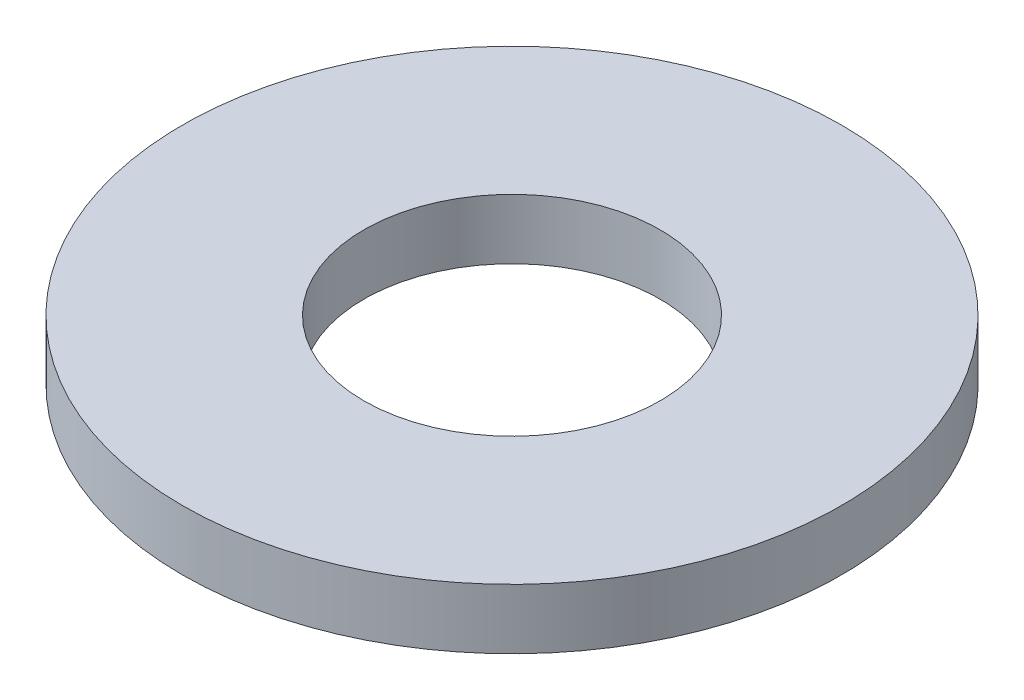
ISO-10303-21;
HEADER;
FILE_DESCRIPTION(('STEP AP214'),'2;1');
FILE_NAME('part.step','',(''),(''),'','','');
FILE_SCHEMA(('AUTOMOTIVE_DESIGN { 1 0 10303 214 1 1 1 1 }'));
ENDSEC;
DATA;
#1=APPLICATION_CONTEXT('core data for automotive mechanical design processes');
#2=APPLICATION_PROTOCOL_DEFINITION('international standard','automotive_design',2000,#1);
#3=PRODUCT_CONTEXT('',#1,'mechanical');
#4=PRODUCT('Part','Part','',(#3));
#5=PRODUCT_RELATED_PRODUCT_CATEGORY('part','',(#4));
#6=PRODUCT_DEFINITION_FORMATION('','',#4);
#7=PRODUCT_DEFINITION_CONTEXT('part definition',#1,'design');
#8=PRODUCT_DEFINITION('design','',#6,#7);
#9=PRODUCT_DEFINITION_SHAPE('','',#8);
#10=(LENGTH_UNIT() NAMED_UNIT(*) SI_UNIT(.MILLI.,.METRE.));
#11=(NAMED_UNIT(*) PLANE_ANGLE_UNIT() SI_UNIT($,.RADIAN.));
#12=(NAMED_UNIT(*) SI_UNIT($,.STERADIAN.) SOLID_ANGLE_UNIT());
#13=UNCERTAINTY_MEASURE_WITH_UNIT(LENGTH_MEASURE(1.E-05),#10,'distance_accuracy_value','');
#14=(GEOMETRIC_REPRESENTATION_CONTEXT(3) GLOBAL_UNCERTAINTY_ASSIGNED_CONTEXT((#13)) GLOBAL_UNIT_ASSIGNED_CONTEXT((#10,
#11,#12)) REPRESENTATION_CONTEXT('',''));
#15=CARTESIAN_POINT('',(0.,0.,0.));
#16=DIRECTION('',(0.,0.,1.));
#17=DIRECTION('',(1.,0.,0.));
#18=AXIS2_PLACEMENT_3D('',#15,#16,#17);
#19=CARTESIAN_POINT('',(0.,1.4478,0.));
#20=DIRECTION('',(0.,-1.,0.));
#21=DIRECTION('',(0.,0.,-0.999999999999999));
#22=AXIS2_PLACEMENT_3D('',#19,#20,#21);
#23=CYLINDRICAL_SURFACE('',#22,7.9375);
#24=CARTESIAN_POINT('',(0.,1.4478,0.));
#25=DIRECTION('',(0.,1.,0.));
#26=DIRECTION('',(0.,0.,0.999999999999999));
#27=AXIS2_PLACEMENT_3D('',#24,#25,#26);
#28=CIRCLE('',#27,7.9375);
#29=CARTESIAN_POINT('',(0.,1.44780000000004,-7.93750000000006));
#30=VERTEX_POINT('',#29);
#31=EDGE_CURVE('E12',#30,#30,#28,.T.);
#32=CARTESIAN_POINT('',(0.,0.,0.));
#33=DIRECTION('',(0.,1.,0.));
#34=DIRECTION('',(0.,0.,0.999999999999999));
#35=AXIS2_PLACEMENT_3D('',#32,#33,#34);
#36=CIRCLE('',#35,7.9375);
#37=CARTESIAN_POINT('',(0.,0.,-7.93750000000007));
#38=VERTEX_POINT('',#37);
#39=EDGE_CURVE('E45',#38,#38,#36,.T.);
#40=CARTESIAN_POINT('',(0.,1.44780000000004,-7.93750000000006));
#41=CARTESIAN_POINT('',(0.,1.43271875000004,-7.93750000000006));
#42=CARTESIAN_POINT('',(0.,1.41763750000004,-7.93750000000006));
#43=CARTESIAN_POINT('',(0.,1.38747500000004,-7.93750000000006));
#44=CARTESIAN_POINT('',(0.,1.37239375000004,-7.93750000000006));
#45=CARTESIAN_POINT('',(0.,1.34223125000004,-7.93750000000006));
#46=CARTESIAN_POINT('',(0.,1.32715000000004,-7.93750000000006));
#47=CARTESIAN_POINT('',(0.,1.29698750000004,-7.93750000000006));
#48=CARTESIAN_POINT('',(0.,1.28190625000004,-7.93750000000007));
#49=CARTESIAN_POINT('',(0.,1.25174375000004,-7.93750000000007));
#50=CARTESIAN_POINT('',(0.,1.23666250000004,-7.93750000000007));
#51=CARTESIAN_POINT('',(0.,1.20650000000004,-7.93750000000007));
#52=CARTESIAN_POINT('',(0.,1.19141875000004,-7.93750000000007));
#53=CARTESIAN_POINT('',(0.,1.16125625000004,-7.93750000000007));
#54=CARTESIAN_POINT('',(0.,1.14617500000004,-7.93750000000007));
#55=CARTESIAN_POINT('',(0.,1.11601250000004,-7.93750000000007));
#56=CARTESIAN_POINT('',(0.,1.10093125000004,-7.93750000000007));
#57=CARTESIAN_POINT('',(0.,1.07076875000004,-7.93750000000007));
#58=CARTESIAN_POINT('',(0.,1.05568750000004,-7.93750000000007));
#59=CARTESIAN_POINT('',(0.,1.02552500000004,-7.93750000000007));
#60=CARTESIAN_POINT('',(0.,1.01044375000004,-7.93750000000007));
#61=CARTESIAN_POINT('',(0.,0.980281250000042,-7.93750000000007));
#62=CARTESIAN_POINT('',(0.,0.965200000000042,-7.93750000000007));
#63=CARTESIAN_POINT('',(0.,0.935037500000042,-7.93750000000007));
#64=CARTESIAN_POINT('',(0.,0.919956250000042,-7.93750000000007));
#65=CARTESIAN_POINT('',(0.,0.889793750000042,-7.93750000000007));
#66=CARTESIAN_POINT('',(0.,0.874712500000042,-7.93750000000007));
#67=CARTESIAN_POINT('',(0.,0.844550000000042,-7.93750000000007));
#68=CARTESIAN_POINT('',(0.,0.829468750000042,-7.93750000000007));
#69=CARTESIAN_POINT('',(0.,0.799306250000042,-7.93750000000007));
#70=CARTESIAN_POINT('',(0.,0.784225000000042,-7.93750000000007));
#71=CARTESIAN_POINT('',(0.,0.754062500000042,-7.93750000000007));
#72=CARTESIAN_POINT('',(0.,0.738981250000042,-7.93750000000007));
#73=CARTESIAN_POINT('',(0.,0.708818750000042,-7.93750000000007));
#74=CARTESIAN_POINT('',(0.,0.693737500000042,-7.93750000000007));
#75=CARTESIAN_POINT('',(0.,0.663575000000042,-7.93750000000007));
#76=CARTESIAN_POINT('',(0.,0.648493750000042,-7.93750000000007));
#77=CARTESIAN_POINT('',(0.,0.618331250000042,-7.93750000000007));
#78=CARTESIAN_POINT('',(0.,0.603250000000042,-7.93750000000007));
#79=CARTESIAN_POINT('',(0.,0.573087500000042,-7.93750000000007));
#80=CARTESIAN_POINT('',(0.,0.558006250000042,-7.93750000000007));
#81=CARTESIAN_POINT('',(0.,0.527843750000042,-7.93750000000007));
#82=CARTESIAN_POINT('',(0.,0.512762500000042,-7.93750000000007));
#83=CARTESIAN_POINT('',(0.,0.482600000000042,-7.93750000000007));
#84=CARTESIAN_POINT('',(0.,0.467518750000042,-7.93750000000007));
#85=CARTESIAN_POINT('',(0.,0.437356250000042,-7.93750000000007));
#86=CARTESIAN_POINT('',(0.,0.422275000000042,-7.93750000000007));
#87=CARTESIAN_POINT('',(0.,0.392112500000042,-7.93750000000007));
#88=CARTESIAN_POINT('',(0.,0.377031250000042,-7.93750000000007));
#89=CARTESIAN_POINT('',(0.,0.346868750000042,-7.93750000000007));
#90=CARTESIAN_POINT('',(0.,0.331787500000042,-7.93750000000007));
#91=CARTESIAN_POINT('',(0.,0.301625000000042,-7.93750000000007));
#92=CARTESIAN_POINT('',(0.,0.286543750000042,-7.93750000000007));
#93=CARTESIAN_POINT('',(0.,0.256381250000042,-7.93750000000007));
#94=CARTESIAN_POINT('',(0.,0.241300000000042,-7.93750000000007));
#95=CARTESIAN_POINT('',(0.,0.211137500000042,-7.93750000000007));
#96=CARTESIAN_POINT('',(0.,0.196056250000042,-7.93750000000007));
#97=CARTESIAN_POINT('',(0.,0.165893750000042,-7.93750000000007));
#98=CARTESIAN_POINT('',(0.,0.150812500000042,-7.93750000000007));
#99=CARTESIAN_POINT('',(0.,0.120650000000042,-7.93750000000007));
#100=CARTESIAN_POINT('',(0.,0.105568750000042,-7.93750000000007));
#101=CARTESIAN_POINT('',(0.,0.0754062500000424,-7.93750000000007));
#102=CARTESIAN_POINT('',(0.,0.0603250000000425,-7.93750000000007));
#103=CARTESIAN_POINT('',(0.,0.0301625000000425,-7.93750000000007));
#104=CARTESIAN_POINT('',(0.,0.0150812500000425,-7.93750000000007));
#105=CARTESIAN_POINT('',(0.,0.,-7.93750000000007));
#106=B_SPLINE_CURVE_WITH_KNOTS('',3,(#40,#41,#42,#43,#44,#45,#46,#47,#48,#49,#50,#51,#52,#53,
#54,#55,#56,#57,#58,#59,#60,#61,#62,#63,#64,#65,#66,#67,#68,#69,#70,#71,#72,#73,#74,#75,#76,#77,
#78,#79,#80,#81,#82,#83,#84,#85,#86,#87,#88,#89,#90,#91,#92,#93,#94,#95,#96,#97,#98,#99,#100,
#101,#102,#103,#104,#105),.UNSPECIFIED.,.F.,.F.,(4,2,2,2,2,2,2,2,2,2,2,2,2,2,2,2,2,2,2,2,2,2,2,
2,2,2,2,2,2,2,2,2,4),(0.,0.04524375,0.0904874999999999,0.13573125,0.180975,0.22621875,0.2714625,
0.31670625,0.36195,0.40719375,0.4524375,0.49768125,0.542925,0.58816875,0.6334125,0.67865625,
0.7239,0.76914375,0.8143875,0.85963125,0.904875,0.950118749999999,0.995362499999999,1.04060625,
1.08585,1.13109375,1.1763375,1.22158125,1.266825,1.31206875,1.3573125,1.40255625,1.4478),.UNSPECIFIED.);
#107=EDGE_CURVE('BSEAM42',#30,#38,#106,.T.);
#108=ORIENTED_EDGE('',*,*,#31,.F.);
#109=ORIENTED_EDGE('',*,*,#39,.T.);
#110=ORIENTED_EDGE('',*,*,#107,.T.);
#111=ORIENTED_EDGE('',*,*,#107,.F.);
#112=EDGE_LOOP('',(#108,#110,#109,#111));
#113=FACE_BOUND('',#112,.T.);
#114=ADVANCED_FACE('F42',(#113),#23,.T.);
#115=CARTESIAN_POINT('',(0.,1.4478,0.));
#116=DIRECTION('',(0.,1.,0.));
#117=DIRECTION('',(0.,0.,0.999999999999999));
#118=AXIS2_PLACEMENT_3D('',#115,#116,#117);
#119=PLANE('',#118);
#120=CARTESIAN_POINT('',(0.,1.4478,0.));
#121=DIRECTION('',(0.,1.,0.));
#122=DIRECTION('',(0.,0.,0.999999999999999));
#123=AXIS2_PLACEMENT_3D('',#120,#121,#122);
#124=CIRCLE('',#123,3.5687);
#125=CARTESIAN_POINT('',(0.,1.44779999999998,3.56870000000001));
#126=VERTEX_POINT('',#125);
#127=EDGE_CURVE('E54',#126,#126,#124,.T.);
#128=ORIENTED_EDGE('',*,*,#127,.F.);
#129=EDGE_LOOP('',(#128));
#130=FACE_BOUND('',#129,.T.);
#131=ORIENTED_EDGE('',*,*,#31,.T.);
#132=EDGE_LOOP('',(#131));
#133=FACE_BOUND('',#132,.T.);
#134=ADVANCED_FACE('F69',(#130,#133),#119,.T.);
#135=CARTESIAN_POINT('',(0.,0.,0.));
#136=DIRECTION('',(0.,1.,0.));
#137=DIRECTION('',(0.,0.,0.999999999999999));
#138=AXIS2_PLACEMENT_3D('',#135,#136,#137);
#139=PLANE('',#138);
#140=CARTESIAN_POINT('',(0.,0.,0.));
#141=DIRECTION('',(0.,1.,0.));
#142=DIRECTION('',(0.,0.,0.999999999999999));
#143=AXIS2_PLACEMENT_3D('',#140,#141,#142);
#144=CIRCLE('',#143,3.5687);
#145=CARTESIAN_POINT('',(0.,0.,3.5687));
#146=VERTEX_POINT('',#145);
#147=EDGE_CURVE('E52',#146,#146,#144,.T.);
#148=ORIENTED_EDGE('',*,*,#147,.T.);
#149=EDGE_LOOP('',(#148));
#150=FACE_BOUND('',#149,.T.);
#151=ORIENTED_EDGE('',*,*,#39,.F.);
#152=EDGE_LOOP('',(#151));
#153=FACE_BOUND('',#152,.T.);
#154=ADVANCED_FACE('F60',(#150,#153),#139,.F.);
#155=CARTESIAN_POINT('',(0.,0.,0.));
#156=DIRECTION('',(0.,1.,0.));
#157=DIRECTION('',(0.,0.,0.999999999999999));
#158=AXIS2_PLACEMENT_3D('',#155,#156,#157);
#159=CYLINDRICAL_SURFACE('',#158,3.5687);
#160=CARTESIAN_POINT('',(0.,0.,3.5687));
#161=CARTESIAN_POINT('',(0.,0.015081249999981,3.5687));
#162=CARTESIAN_POINT('',(0.,0.030162499999981,3.5687));
#163=CARTESIAN_POINT('',(0.,0.0603249999999809,3.5687));
#164=CARTESIAN_POINT('',(0.,0.0754062499999809,3.5687));
#165=CARTESIAN_POINT('',(0.,0.105568749999981,3.5687));
#166=CARTESIAN_POINT('',(0.,0.120649999999981,3.5687));
#167=CARTESIAN_POINT('',(0.,0.150812499999981,3.5687));
#168=CARTESIAN_POINT('',(0.,0.165893749999981,3.5687));
#169=CARTESIAN_POINT('',(0.,0.196056249999981,3.5687));
#170=CARTESIAN_POINT('',(0.,0.211137499999981,3.5687));
#171=CARTESIAN_POINT('',(0.,0.241299999999981,3.5687));
#172=CARTESIAN_POINT('',(0.,0.256381249999981,3.5687));
#173=CARTESIAN_POINT('',(0.,0.286543749999981,3.5687));
#174=CARTESIAN_POINT('',(0.,0.301624999999981,3.5687));
#175=CARTESIAN_POINT('',(0.,0.331787499999981,3.5687));
#176=CARTESIAN_POINT('',(0.,0.346868749999981,3.5687));
#177=CARTESIAN_POINT('',(0.,0.377031249999981,3.5687));
#178=CARTESIAN_POINT('',(0.,0.392112499999981,3.5687));
#179=CARTESIAN_POINT('',(0.,0.422274999999981,3.5687));
#180=CARTESIAN_POINT('',(0.,0.437356249999981,3.5687));
#181=CARTESIAN_POINT('',(0.,0.467518749999981,3.5687));
#182=CARTESIAN_POINT('',(0.,0.482599999999981,3.5687));
#183=CARTESIAN_POINT('',(0.,0.51276249999998,3.5687));
#184=CARTESIAN_POINT('',(0.,0.527843749999981,3.5687));
#185=CARTESIAN_POINT('',(0.,0.55800624999998,3.5687));
#186=CARTESIAN_POINT('',(0.,0.57308749999998,3.5687));
#187=CARTESIAN_POINT('',(0.,0.60324999999998,3.5687));
#188=CARTESIAN_POINT('',(0.,0.61833124999998,3.5687));
#189=CARTESIAN_POINT('',(0.,0.64849374999998,3.5687));
#190=CARTESIAN_POINT('',(0.,0.66357499999998,3.5687));
#191=CARTESIAN_POINT('',(0.,0.69373749999998,3.5687));
#192=CARTESIAN_POINT('',(0.,0.70881874999998,3.5687));
#193=CARTESIAN_POINT('',(0.,0.73898124999998,3.5687));
#194=CARTESIAN_POINT('',(0.,0.75406249999998,3.5687));
#195=CARTESIAN_POINT('',(0.,0.78422499999998,3.5687));
#196=CARTESIAN_POINT('',(0.,0.79930624999998,3.5687));
#197=CARTESIAN_POINT('',(0.,0.82946874999998,3.5687));
#198=CARTESIAN_POINT('',(0.,0.84454999999998,3.5687));
#199=CARTESIAN_POINT('',(0.,0.87471249999998,3.5687));
#200=CARTESIAN_POINT('',(0.,0.88979374999998,3.5687));
#201=CARTESIAN_POINT('',(0.,0.91995624999998,3.5687));
#202=CARTESIAN_POINT('',(0.,0.93503749999998,3.5687));
#203=CARTESIAN_POINT('',(0.,0.96519999999998,3.5687));
#204=CARTESIAN_POINT('',(0.,0.98028124999998,3.5687));
#205=CARTESIAN_POINT('',(0.,1.01044374999998,3.5687));
#206=CARTESIAN_POINT('',(0.,1.02552499999998,3.5687));
#207=CARTESIAN_POINT('',(0.,1.05568749999998,3.5687));
#208=CARTESIAN_POINT('',(0.,1.07076874999998,3.5687));
#209=CARTESIAN_POINT('',(0.,1.10093124999998,3.5687));
#210=CARTESIAN_POINT('',(0.,1.11601249999998,3.5687));
#211=CARTESIAN_POINT('',(0.,1.14617499999998,3.5687));
#212=CARTESIAN_POINT('',(0.,1.16125624999998,3.5687));
#213=CARTESIAN_POINT('',(0.,1.19141874999998,3.5687));
#214=CARTESIAN_POINT('',(0.,1.20649999999998,3.5687));
#215=CARTESIAN_POINT('',(0.,1.23666249999998,3.5687));
#216=CARTESIAN_POINT('',(0.,1.25174374999998,3.56870000000001));
#217=CARTESIAN_POINT('',(0.,1.28190624999998,3.56870000000001));
#218=CARTESIAN_POINT('',(0.,1.29698749999998,3.56870000000001));
#219=CARTESIAN_POINT('',(0.,1.32714999999998,3.56870000000001));
#220=CARTESIAN_POINT('',(0.,1.34223124999998,3.56870000000001));
#221=CARTESIAN_POINT('',(0.,1.37239374999998,3.56870000000001));
#222=CARTESIAN_POINT('',(0.,1.38747499999998,3.56870000000001));
#223=CARTESIAN_POINT('',(0.,1.41763749999998,3.56870000000001));
#224=CARTESIAN_POINT('',(0.,1.43271874999998,3.56870000000001));
#225=CARTESIAN_POINT('',(0.,1.44779999999998,3.56870000000001));
#226=B_SPLINE_CURVE_WITH_KNOTS('',3,(#160,#161,#162,#163,#164,#165,#166,#167,#168,#169,#170,
#171,#172,#173,#174,#175,#176,#177,#178,#179,#180,#181,#182,#183,#184,#185,#186,#187,#188,#189,
#190,#191,#192,#193,#194,#195,#196,#197,#198,#199,#200,#201,#202,#203,#204,#205,#206,#207,#208,
#209,#210,#211,#212,#213,#214,#215,#216,#217,#218,#219,#220,#221,#222,#223,#224,#225),
.UNSPECIFIED.,.F.,.F.,(4,2,2,2,2,2,2,2,2,2,2,2,2,2,2,2,2,2,2,2,2,2,2,2,2,2,2,2,2,2,2,2,4),(0.,
0.04524375,0.0904874999999999,0.13573125,0.180975,0.22621875,0.2714625,0.31670625,0.36195,
0.40719375,0.4524375,0.497681249999999,0.542924999999999,0.588168749999999,0.633412499999999,
0.678656249999999,0.723899999999999,0.769143749999999,0.814387499999999,0.859631249999999,
0.904874999999999,0.950118749999999,0.995362499999999,1.04060625,1.08585,1.13109375,1.1763375,
1.22158125,1.266825,1.31206875,1.3573125,1.40255625,1.4478),.UNSPECIFIED.);
#227=EDGE_CURVE('BSEAM63',#146,#126,#226,.T.);
#228=ORIENTED_EDGE('',*,*,#147,.F.);
#229=ORIENTED_EDGE('',*,*,#127,.T.);
#230=ORIENTED_EDGE('',*,*,#227,.T.);
#231=ORIENTED_EDGE('',*,*,#227,.F.);
#232=EDGE_LOOP('',(#228,#230,#229,#231));
#233=FACE_BOUND('',#232,.T.);
#234=ADVANCED_FACE('F63',(#233),#159,.F.);
#235=CLOSED_SHELL('',(#114,#134,#154,#234));
#236=MANIFOLD_SOLID_BREP('B2',#235);
#237=ADVANCED_BREP_SHAPE_REPRESENTATION('',(#18,#236),#14);
#238=SHAPE_DEFINITION_REPRESENTATION(#9,#237);
ENDSEC;
END-ISO-10303-21;
